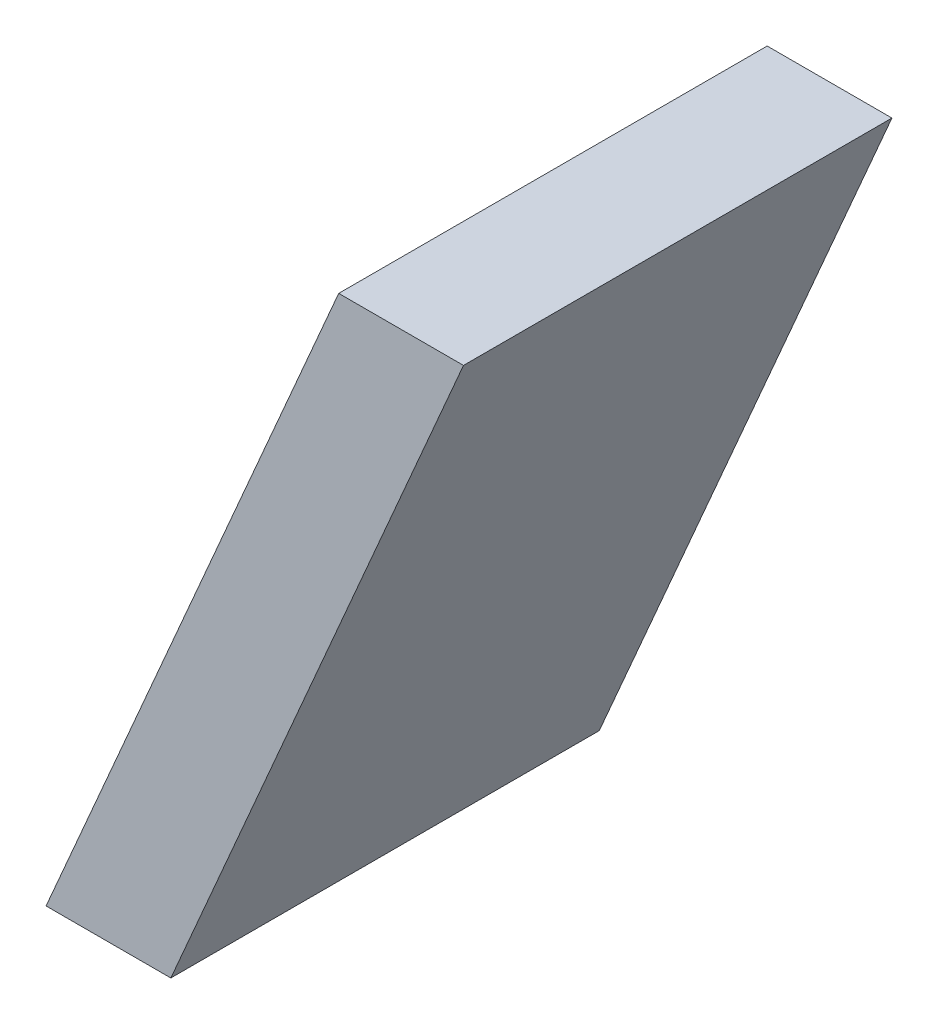
ISO-10303-21;
HEADER;
FILE_DESCRIPTION(('STEP AP214'),'2;1');
FILE_NAME('part.step','',(''),(''),'','','');
FILE_SCHEMA(('AUTOMOTIVE_DESIGN { 1 0 10303 214 1 1 1 1 }'));
ENDSEC;
DATA;
#1=APPLICATION_CONTEXT('core data for automotive mechanical design processes');
#2=APPLICATION_PROTOCOL_DEFINITION('international standard','automotive_design',2000,#1);
#3=PRODUCT_CONTEXT('',#1,'mechanical');
#4=PRODUCT('Part','Part','',(#3));
#5=PRODUCT_RELATED_PRODUCT_CATEGORY('part','',(#4));
#6=PRODUCT_DEFINITION_FORMATION('','',#4);
#7=PRODUCT_DEFINITION_CONTEXT('part definition',#1,'design');
#8=PRODUCT_DEFINITION('design','',#6,#7);
#9=PRODUCT_DEFINITION_SHAPE('','',#8);
#10=(LENGTH_UNIT() NAMED_UNIT(*) SI_UNIT(.MILLI.,.METRE.));
#11=(NAMED_UNIT(*) PLANE_ANGLE_UNIT() SI_UNIT($,.RADIAN.));
#12=(NAMED_UNIT(*) SI_UNIT($,.STERADIAN.) SOLID_ANGLE_UNIT());
#13=UNCERTAINTY_MEASURE_WITH_UNIT(LENGTH_MEASURE(1.E-05),#10,'distance_accuracy_value','');
#14=(GEOMETRIC_REPRESENTATION_CONTEXT(3) GLOBAL_UNCERTAINTY_ASSIGNED_CONTEXT((#13)) GLOBAL_UNIT_ASSIGNED_CONTEXT((#10,
#11,#12)) REPRESENTATION_CONTEXT('',''));
#15=CARTESIAN_POINT('',(0.,0.,0.));
#16=DIRECTION('',(0.,0.,1.));
#17=DIRECTION('',(1.,0.,0.));
#18=AXIS2_PLACEMENT_3D('',#15,#16,#17);
#19=CARTESIAN_POINT('',(5.699096434001,1.348369316638,0.));
#20=DIRECTION('',(-0.917874415525827,0.396870958024294,0.));
#21=DIRECTION('',(-0.396870958024294,-0.917874415525827,0.));
#22=AXIS2_PLACEMENT_3D('',#19,#20,#21);
#23=PLANE('',#22);
#24=DIRECTION('',(-0.396870958024294,-0.917874415525827,0.));
#25=VECTOR('',#24,1.);
#26=CARTESIAN_POINT('',(5.699096434001,1.348369316638,0.));
#27=LINE('',#26,#25);
#28=CARTESIAN_POINT('',(5.699096434001,1.348369316638,0.));
#29=VERTEX_POINT('',#28);
#30=CARTESIAN_POINT('',(5.630789724222,1.190391061874,0.));
#31=VERTEX_POINT('',#30);
#32=EDGE_CURVE('E11',#29,#31,#27,.T.);
#33=ORIENTED_EDGE('',*,*,#32,.T.);
#34=DIRECTION('',(0.,0.,1.));
#35=VECTOR('',#34,1.);
#36=CARTESIAN_POINT('',(5.630789724222,1.190391061874,0.));
#37=LINE('',#36,#35);
#38=CARTESIAN_POINT('',(5.630789724222,1.190391061874,0.1));
#39=VERTEX_POINT('',#38);
#40=EDGE_CURVE('E24',#31,#39,#37,.T.);
#41=ORIENTED_EDGE('',*,*,#40,.T.);
#42=DIRECTION('',(-0.396870958024294,-0.917874415525827,0.));
#43=VECTOR('',#42,1.);
#44=CARTESIAN_POINT('',(5.699096434001,1.348369316638,0.1));
#45=LINE('',#44,#43);
#46=CARTESIAN_POINT('',(5.699096434001,1.348369316638,0.1));
#47=VERTEX_POINT('',#46);
#48=EDGE_CURVE('E75',#47,#39,#45,.T.);
#49=ORIENTED_EDGE('',*,*,#48,.F.);
#50=DIRECTION('',(0.,0.,1.));
#51=VECTOR('',#50,1.);
#52=CARTESIAN_POINT('',(5.699096434001,1.348369316638,0.));
#53=LINE('',#52,#51);
#54=EDGE_CURVE('E86',#29,#47,#53,.T.);
#55=ORIENTED_EDGE('',*,*,#54,.F.);
#56=EDGE_LOOP('',(#33,#41,#49,#55));
#57=FACE_BOUND('',#56,.T.);
#58=ADVANCED_FACE('F17',(#57),#23,.T.);
#59=CARTESIAN_POINT('',(5.728219048062,1.348369316638,0.));
#60=DIRECTION('',(0.,1.,0.));
#61=DIRECTION('',(-1.,0.,0.));
#62=AXIS2_PLACEMENT_3D('',#59,#60,#61);
#63=PLANE('',#62);
#64=DIRECTION('',(-1.,0.,0.));
#65=VECTOR('',#64,1.);
#66=CARTESIAN_POINT('',(5.728219048062,1.348369316638,0.));
#67=LINE('',#66,#65);
#68=CARTESIAN_POINT('',(5.728219048062,1.348369316638,0.));
#69=VERTEX_POINT('',#68);
#70=EDGE_CURVE('E83',#69,#29,#67,.T.);
#71=ORIENTED_EDGE('',*,*,#70,.T.);
#72=ORIENTED_EDGE('',*,*,#54,.T.);
#73=DIRECTION('',(-1.,0.,0.));
#74=VECTOR('',#73,1.);
#75=CARTESIAN_POINT('',(5.728219048062,1.348369316638,0.1));
#76=LINE('',#75,#74);
#77=CARTESIAN_POINT('',(5.728219048062,1.348369316638,0.1));
#78=VERTEX_POINT('',#77);
#79=EDGE_CURVE('E81',#78,#47,#76,.T.);
#80=ORIENTED_EDGE('',*,*,#79,.F.);
#81=DIRECTION('',(0.,0.,1.));
#82=VECTOR('',#81,1.);
#83=CARTESIAN_POINT('',(5.728219048062,1.348369316638,0.));
#84=LINE('',#83,#82);
#85=EDGE_CURVE('E61',#69,#78,#84,.T.);
#86=ORIENTED_EDGE('',*,*,#85,.F.);
#87=EDGE_LOOP('',(#71,#72,#80,#86));
#88=FACE_BOUND('',#87,.T.);
#89=ADVANCED_FACE('F91',(#88),#63,.T.);
#90=CARTESIAN_POINT('',(5.659912338283,1.190391061874,0.));
#91=DIRECTION('',(0.917874415525827,-0.396870958024294,0.));
#92=DIRECTION('',(0.396870958024294,0.917874415525827,0.));
#93=AXIS2_PLACEMENT_3D('',#90,#91,#92);
#94=PLANE('',#93);
#95=DIRECTION('',(0.396870958024294,0.917874415525827,0.));
#96=VECTOR('',#95,1.);
#97=CARTESIAN_POINT('',(5.659912338283,1.190391061874,0.));
#98=LINE('',#97,#96);
#99=CARTESIAN_POINT('',(5.659912338283,1.190391061874,0.));
#100=VERTEX_POINT('',#99);
#101=EDGE_CURVE('E65',#100,#69,#98,.T.);
#102=ORIENTED_EDGE('',*,*,#101,.T.);
#103=ORIENTED_EDGE('',*,*,#85,.T.);
#104=DIRECTION('',(0.396870958024294,0.917874415525827,0.));
#105=VECTOR('',#104,1.);
#106=CARTESIAN_POINT('',(5.659912338283,1.190391061874,0.1));
#107=LINE('',#106,#105);
#108=CARTESIAN_POINT('',(5.659912338283,1.190391061874,0.1));
#109=VERTEX_POINT('',#108);
#110=EDGE_CURVE('E54',#109,#78,#107,.T.);
#111=ORIENTED_EDGE('',*,*,#110,.F.);
#112=DIRECTION('',(0.,0.,1.));
#113=VECTOR('',#112,1.);
#114=CARTESIAN_POINT('',(5.659912338283,1.190391061874,0.));
#115=LINE('',#114,#113);
#116=EDGE_CURVE('E58',#100,#109,#115,.T.);
#117=ORIENTED_EDGE('',*,*,#116,.F.);
#118=EDGE_LOOP('',(#102,#103,#111,#117));
#119=FACE_BOUND('',#118,.T.);
#120=ADVANCED_FACE('F57',(#119),#94,.T.);
#121=CARTESIAN_POINT('',(5.630789724222,1.190391061874,0.));
#122=DIRECTION('',(0.,-1.,0.));
#123=DIRECTION('',(1.,0.,0.));
#124=AXIS2_PLACEMENT_3D('',#121,#122,#123);
#125=PLANE('',#124);
#126=DIRECTION('',(1.,0.,0.));
#127=VECTOR('',#126,1.);
#128=CARTESIAN_POINT('',(5.630789724222,1.190391061874,0.));
#129=LINE('',#128,#127);
#130=EDGE_CURVE('E71',#31,#100,#129,.T.);
#131=ORIENTED_EDGE('',*,*,#130,.T.);
#132=ORIENTED_EDGE('',*,*,#116,.T.);
#133=DIRECTION('',(1.,0.,0.));
#134=VECTOR('',#133,1.);
#135=CARTESIAN_POINT('',(5.630789724222,1.190391061874,0.1));
#136=LINE('',#135,#134);
#137=EDGE_CURVE('E70',#39,#109,#136,.T.);
#138=ORIENTED_EDGE('',*,*,#137,.F.);
#139=ORIENTED_EDGE('',*,*,#40,.F.);
#140=EDGE_LOOP('',(#131,#132,#138,#139));
#141=FACE_BOUND('',#140,.T.);
#142=ADVANCED_FACE('F69',(#141),#125,.T.);
#143=CARTESIAN_POINT('',(5.679504386142,1.269380189256,0.1));
#144=DIRECTION('',(0.,0.,1.));
#145=DIRECTION('',(1.,0.,0.));
#146=AXIS2_PLACEMENT_3D('',#143,#144,#145);
#147=PLANE('',#146);
#148=ORIENTED_EDGE('',*,*,#137,.T.);
#149=ORIENTED_EDGE('',*,*,#110,.T.);
#150=ORIENTED_EDGE('',*,*,#79,.T.);
#151=ORIENTED_EDGE('',*,*,#48,.T.);
#152=EDGE_LOOP('',(#148,#149,#150,#151));
#153=FACE_BOUND('',#152,.T.);
#154=ADVANCED_FACE('F74',(#153),#147,.T.);
#155=CARTESIAN_POINT('',(5.679504386142,1.269380189256,0.));
#156=DIRECTION('',(0.,0.,1.));
#157=DIRECTION('',(1.,0.,0.));
#158=AXIS2_PLACEMENT_3D('',#155,#156,#157);
#159=PLANE('',#158);
#160=ORIENTED_EDGE('',*,*,#130,.F.);
#161=ORIENTED_EDGE('',*,*,#32,.F.);
#162=ORIENTED_EDGE('',*,*,#70,.F.);
#163=ORIENTED_EDGE('',*,*,#101,.F.);
#164=EDGE_LOOP('',(#160,#161,#162,#163));
#165=FACE_BOUND('',#164,.T.);
#166=ADVANCED_FACE('F89',(#165),#159,.F.);
#167=CLOSED_SHELL('',(#58,#89,#120,#142,#154,#166));
#168=MANIFOLD_SOLID_BREP('B1',#167);
#169=ADVANCED_BREP_SHAPE_REPRESENTATION('',(#18,#168),#14);
#170=SHAPE_DEFINITION_REPRESENTATION(#9,#169);
ENDSEC;
END-ISO-10303-21;
